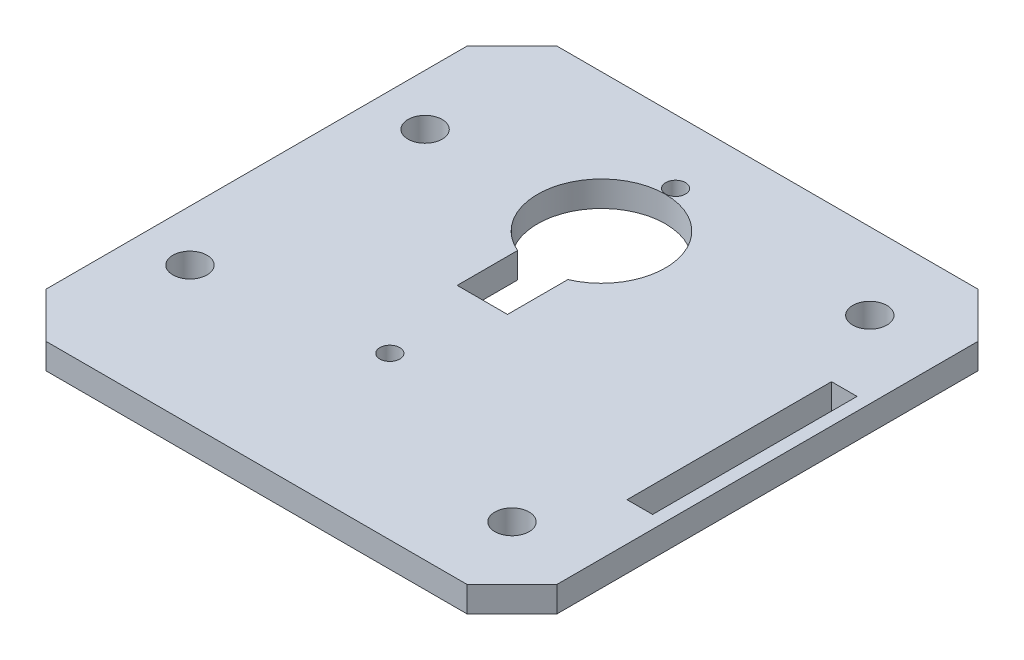
ISO-10303-21;
HEADER;
FILE_DESCRIPTION(('STEP AP214'),'2;1');
FILE_NAME('part.step','',(''),(''),'','','');
FILE_SCHEMA(('AUTOMOTIVE_DESIGN { 1 0 10303 214 1 1 1 1 }'));
ENDSEC;
DATA;
#1=APPLICATION_CONTEXT('core data for automotive mechanical design processes');
#2=APPLICATION_PROTOCOL_DEFINITION('international standard','automotive_design',2000,#1);
#3=PRODUCT_CONTEXT('',#1,'mechanical');
#4=PRODUCT('Part','Part','',(#3));
#5=PRODUCT_RELATED_PRODUCT_CATEGORY('part','',(#4));
#6=PRODUCT_DEFINITION_FORMATION('','',#4);
#7=PRODUCT_DEFINITION_CONTEXT('part definition',#1,'design');
#8=PRODUCT_DEFINITION('design','',#6,#7);
#9=PRODUCT_DEFINITION_SHAPE('','',#8);
#10=(LENGTH_UNIT() NAMED_UNIT(*) SI_UNIT(.MILLI.,.METRE.));
#11=(NAMED_UNIT(*) PLANE_ANGLE_UNIT() SI_UNIT($,.RADIAN.));
#12=(NAMED_UNIT(*) SI_UNIT($,.STERADIAN.) SOLID_ANGLE_UNIT());
#13=UNCERTAINTY_MEASURE_WITH_UNIT(LENGTH_MEASURE(1.E-05),#10,'distance_accuracy_value','');
#14=(GEOMETRIC_REPRESENTATION_CONTEXT(3) GLOBAL_UNCERTAINTY_ASSIGNED_CONTEXT((#13)) GLOBAL_UNIT_ASSIGNED_CONTEXT((#10,
#11,#12)) REPRESENTATION_CONTEXT('',''));
#15=CARTESIAN_POINT('',(0.,0.,0.));
#16=DIRECTION('',(0.,0.,1.));
#17=DIRECTION('',(1.,0.,0.));
#18=AXIS2_PLACEMENT_3D('',#15,#16,#17);
#19=CARTESIAN_POINT('',(0.,0.,0.));
#20=DIRECTION('',(0.,-1.,0.));
#21=DIRECTION('',(0.,0.,-1.));
#22=AXIS2_PLACEMENT_3D('',#19,#20,#21);
#23=PLANE('',#22);
#24=DIRECTION('',(1.,0.,0.));
#25=VECTOR('',#24,1.);
#26=CARTESIAN_POINT('',(0.,0.,-10.16));
#27=LINE('',#26,#25);
#28=CARTESIAN_POINT('',(21.59,0.,-10.16));
#29=VERTEX_POINT('',#28);
#30=CARTESIAN_POINT('',(24.13,0.,-10.16));
#31=VERTEX_POINT('',#30);
#32=EDGE_CURVE('E210',#29,#31,#27,.T.);
#33=ORIENTED_EDGE('',*,*,#32,.F.);
#34=DIRECTION('',(0.,0.,-1.));
#35=VECTOR('',#34,1.);
#36=CARTESIAN_POINT('',(21.59,0.,0.));
#37=LINE('',#36,#35);
#38=CARTESIAN_POINT('',(21.59,0.,10.16));
#39=VERTEX_POINT('',#38);
#40=EDGE_CURVE('E190',#39,#29,#37,.T.);
#41=ORIENTED_EDGE('',*,*,#40,.F.);
#42=DIRECTION('',(1.,0.,0.));
#43=VECTOR('',#42,1.);
#44=CARTESIAN_POINT('',(0.,0.,10.16));
#45=LINE('',#44,#43);
#46=CARTESIAN_POINT('',(24.13,0.,10.16));
#47=VERTEX_POINT('',#46);
#48=EDGE_CURVE('E192',#39,#47,#45,.T.);
#49=ORIENTED_EDGE('',*,*,#48,.T.);
#50=DIRECTION('',(0.,0.,-1.));
#51=VECTOR('',#50,1.);
#52=CARTESIAN_POINT('',(24.13,0.,0.));
#53=LINE('',#52,#51);
#54=EDGE_CURVE('E196',#47,#31,#53,.T.);
#55=ORIENTED_EDGE('',*,*,#54,.T.);
#56=EDGE_LOOP('',(#33,#41,#49,#55));
#57=FACE_BOUND('',#56,.T.);
#58=CARTESIAN_POINT('',(-2.79400000000002,0.,-19.05));
#59=DIRECTION('',(0.,1.,0.));
#60=DIRECTION('',(0.,0.,1.));
#61=AXIS2_PLACEMENT_3D('',#58,#59,#60);
#62=CIRCLE('',#61,0.990599999999999);
#63=CARTESIAN_POINT('',(-2.79400000000002,0.,-18.0594));
#64=VERTEX_POINT('',#63);
#65=EDGE_CURVE('E217',#64,#64,#62,.T.);
#66=ORIENTED_EDGE('',*,*,#65,.T.);
#67=EDGE_LOOP('',(#66));
#68=FACE_BOUND('',#67,.T.);
#69=CARTESIAN_POINT('',(-2.79400000000002,0.,9.3472));
#70=DIRECTION('',(0.,1.,0.));
#71=DIRECTION('',(0.,0.,1.));
#72=AXIS2_PLACEMENT_3D('',#69,#70,#71);
#73=CIRCLE('',#72,0.990600000000002);
#74=CARTESIAN_POINT('',(-2.79400000000002,0.,10.3378));
#75=VERTEX_POINT('',#74);
#76=EDGE_CURVE('E610',#75,#75,#73,.T.);
#77=ORIENTED_EDGE('',*,*,#76,.T.);
#78=EDGE_LOOP('',(#77));
#79=FACE_BOUND('',#78,.T.);
#80=CARTESIAN_POINT('',(-2.79400000000002,0.,-11.684));
#81=DIRECTION('',(0.,1.,0.));
#82=DIRECTION('',(0.,0.,1.));
#83=AXIS2_PLACEMENT_3D('',#80,#81,#82);
#84=CIRCLE('',#83,6.35);
#85=CARTESIAN_POINT('',(-0.294000000000018,0.,-5.84683459203013));
#86=VERTEX_POINT('',#85);
#87=CARTESIAN_POINT('',(-5.29400000000002,0.,-5.84683459203013));
#88=VERTEX_POINT('',#87);
#89=EDGE_CURVE('E154',#86,#88,#84,.T.);
#90=ORIENTED_EDGE('',*,*,#89,.T.);
#91=DIRECTION('',(0.,0.,1.));
#92=VECTOR('',#91,1.);
#93=CARTESIAN_POINT('',(-5.29400000000002,0.,-5.84683459203013));
#94=LINE('',#93,#92);
#95=CARTESIAN_POINT('',(-5.29400000000002,0.,0.153165407969866));
#96=VERTEX_POINT('',#95);
#97=EDGE_CURVE('E163',#88,#96,#94,.T.);
#98=ORIENTED_EDGE('',*,*,#97,.T.);
#99=DIRECTION('',(1.,0.,0.));
#100=VECTOR('',#99,1.);
#101=CARTESIAN_POINT('',(-5.29400000000002,0.,0.153165407969866));
#102=LINE('',#101,#100);
#103=CARTESIAN_POINT('',(-0.294000000000017,0.,0.153165407969866));
#104=VERTEX_POINT('',#103);
#105=EDGE_CURVE('E54',#96,#104,#102,.T.);
#106=ORIENTED_EDGE('',*,*,#105,.T.);
#107=DIRECTION('',(0.,0.,-1.));
#108=VECTOR('',#107,1.);
#109=CARTESIAN_POINT('',(-0.294000000000018,0.,-5.84683459203013));
#110=LINE('',#109,#108);
#111=EDGE_CURVE('E160',#104,#86,#110,.T.);
#112=ORIENTED_EDGE('',*,*,#111,.T.);
#113=EDGE_LOOP('',(#90,#98,#106,#112));
#114=FACE_BOUND('',#113,.T.);
#115=CARTESIAN_POINT('',(17.78,0.,17.78));
#116=DIRECTION('',(0.,1.,0.));
#117=DIRECTION('',(0.,0.,1.));
#118=AXIS2_PLACEMENT_3D('',#115,#116,#117);
#119=CIRCLE('',#118,1.7);
#120=CARTESIAN_POINT('',(17.78,0.,19.48));
#121=VERTEX_POINT('',#120);
#122=EDGE_CURVE('E266',#121,#121,#119,.T.);
#123=ORIENTED_EDGE('',*,*,#122,.T.);
#124=EDGE_LOOP('',(#123));
#125=FACE_BOUND('',#124,.T.);
#126=CARTESIAN_POINT('',(17.78,0.,-17.78));
#127=DIRECTION('',(0.,1.,0.));
#128=DIRECTION('',(0.,0.,1.));
#129=AXIS2_PLACEMENT_3D('',#126,#127,#128);
#130=CIRCLE('',#129,1.7);
#131=CARTESIAN_POINT('',(17.78,0.,-16.08));
#132=VERTEX_POINT('',#131);
#133=EDGE_CURVE('E272',#132,#132,#130,.T.);
#134=ORIENTED_EDGE('',*,*,#133,.T.);
#135=EDGE_LOOP('',(#134));
#136=FACE_BOUND('',#135,.T.);
#137=CARTESIAN_POINT('',(-20.32,0.,11.684));
#138=DIRECTION('',(0.,1.,0.));
#139=DIRECTION('',(0.,0.,1.));
#140=AXIS2_PLACEMENT_3D('',#137,#138,#139);
#141=CIRCLE('',#140,1.7);
#142=CARTESIAN_POINT('',(-20.32,0.,13.384));
#143=VERTEX_POINT('',#142);
#144=EDGE_CURVE('E278',#143,#143,#141,.T.);
#145=ORIENTED_EDGE('',*,*,#144,.T.);
#146=EDGE_LOOP('',(#145));
#147=FACE_BOUND('',#146,.T.);
#148=CARTESIAN_POINT('',(-20.32,0.,-11.684));
#149=DIRECTION('',(0.,1.,0.));
#150=DIRECTION('',(0.,0.,1.));
#151=AXIS2_PLACEMENT_3D('',#148,#149,#150);
#152=CIRCLE('',#151,1.7);
#153=CARTESIAN_POINT('',(-20.32,0.,-9.98399999999999));
#154=VERTEX_POINT('',#153);
#155=EDGE_CURVE('E284',#154,#154,#152,.T.);
#156=ORIENTED_EDGE('',*,*,#155,.T.);
#157=EDGE_LOOP('',(#156));
#158=FACE_BOUND('',#157,.T.);
#159=DIRECTION('',(0.,0.,1.));
#160=VECTOR('',#159,1.);
#161=CARTESIAN_POINT('',(-25.4,0.,25.4));
#162=LINE('',#161,#160);
#163=CARTESIAN_POINT('',(-25.4,0.,-20.9098719394654));
#164=VERTEX_POINT('',#163);
#165=CARTESIAN_POINT('',(-25.4,0.,20.9098719394654));
#166=VERTEX_POINT('',#165);
#167=EDGE_CURVE('E299',#164,#166,#162,.T.);
#168=ORIENTED_EDGE('',*,*,#167,.F.);
#169=DIRECTION('',(0.707106781186548,0.,-0.707106781186548));
#170=VECTOR('',#169,1.);
#171=CARTESIAN_POINT('',(-20.9098719394654,0.,-25.4));
#172=LINE('',#171,#170);
#173=CARTESIAN_POINT('',(-20.9098719394654,0.,-25.4));
#174=VERTEX_POINT('',#173);
#175=EDGE_CURVE('E222',#164,#174,#172,.T.);
#176=ORIENTED_EDGE('',*,*,#175,.T.);
#177=DIRECTION('',(-1.,0.,0.));
#178=VECTOR('',#177,1.);
#179=CARTESIAN_POINT('',(-25.4,0.,-25.4));
#180=LINE('',#179,#178);
#181=CARTESIAN_POINT('',(20.9098719394654,0.,-25.4));
#182=VERTEX_POINT('',#181);
#183=EDGE_CURVE('E297',#182,#174,#180,.T.);
#184=ORIENTED_EDGE('',*,*,#183,.F.);
#185=DIRECTION('',(-0.707106781186548,0.,-0.707106781186548));
#186=VECTOR('',#185,1.);
#187=CARTESIAN_POINT('',(20.9098719394654,0.,-25.4));
#188=LINE('',#187,#186);
#189=CARTESIAN_POINT('',(25.4,0.,-20.9098719394654));
#190=VERTEX_POINT('',#189);
#191=EDGE_CURVE('E232',#190,#182,#188,.T.);
#192=ORIENTED_EDGE('',*,*,#191,.F.);
#193=DIRECTION('',(0.,0.,-1.));
#194=VECTOR('',#193,1.);
#195=CARTESIAN_POINT('',(25.4,0.,25.4));
#196=LINE('',#195,#194);
#197=CARTESIAN_POINT('',(25.4,0.,20.9098719394654));
#198=VERTEX_POINT('',#197);
#199=EDGE_CURVE('E287',#198,#190,#196,.T.);
#200=ORIENTED_EDGE('',*,*,#199,.F.);
#201=DIRECTION('',(-0.707106781186548,0.,0.707106781186548));
#202=VECTOR('',#201,1.);
#203=CARTESIAN_POINT('',(20.9098719394654,0.,25.4));
#204=LINE('',#203,#202);
#205=CARTESIAN_POINT('',(20.9098719394654,0.,25.4));
#206=VERTEX_POINT('',#205);
#207=EDGE_CURVE('E243',#198,#206,#204,.T.);
#208=ORIENTED_EDGE('',*,*,#207,.T.);
#209=DIRECTION('',(1.,0.,0.));
#210=VECTOR('',#209,1.);
#211=CARTESIAN_POINT('',(-25.4,0.,25.4));
#212=LINE('',#211,#210);
#213=CARTESIAN_POINT('',(-20.9098719394654,0.,25.4));
#214=VERTEX_POINT('',#213);
#215=EDGE_CURVE('E41',#214,#206,#212,.T.);
#216=ORIENTED_EDGE('',*,*,#215,.F.);
#217=DIRECTION('',(0.707106781186548,0.,0.707106781186548));
#218=VECTOR('',#217,1.);
#219=CARTESIAN_POINT('',(-20.9098719394654,0.,25.4));
#220=LINE('',#219,#218);
#221=EDGE_CURVE('E253',#166,#214,#220,.T.);
#222=ORIENTED_EDGE('',*,*,#221,.F.);
#223=EDGE_LOOP('',(#168,#176,#184,#192,#200,#208,#216,#222));
#224=FACE_BOUND('',#223,.T.);
#225=ADVANCED_FACE('F37',(#57,#68,#79,#114,#125,#136,#147,#158,#224),#23,.T.);
#226=CARTESIAN_POINT('',(0.,2.54,0.));
#227=DIRECTION('',(0.,-1.,0.));
#228=DIRECTION('',(0.,0.,-1.));
#229=AXIS2_PLACEMENT_3D('',#226,#227,#228);
#230=PLANE('',#229);
#231=CARTESIAN_POINT('',(-2.79400000000002,2.54,-19.05));
#232=DIRECTION('',(0.,1.,0.));
#233=DIRECTION('',(0.,0.,1.));
#234=AXIS2_PLACEMENT_3D('',#231,#232,#233);
#235=CIRCLE('',#234,0.990599999999999);
#236=CARTESIAN_POINT('',(-2.79400000000002,2.54,-18.0594));
#237=VERTEX_POINT('',#236);
#238=EDGE_CURVE('E609',#237,#237,#235,.T.);
#239=ORIENTED_EDGE('',*,*,#238,.F.);
#240=EDGE_LOOP('',(#239));
#241=FACE_BOUND('',#240,.T.);
#242=CARTESIAN_POINT('',(-2.79400000000002,2.54,9.3472));
#243=DIRECTION('',(0.,1.,0.));
#244=DIRECTION('',(0.,0.,1.));
#245=AXIS2_PLACEMENT_3D('',#242,#243,#244);
#246=CIRCLE('',#245,0.990600000000002);
#247=CARTESIAN_POINT('',(-2.79400000000002,2.54,10.3378));
#248=VERTEX_POINT('',#247);
#249=EDGE_CURVE('E175',#248,#248,#246,.T.);
#250=ORIENTED_EDGE('',*,*,#249,.F.);
#251=EDGE_LOOP('',(#250));
#252=FACE_BOUND('',#251,.T.);
#253=DIRECTION('',(0.,0.,1.));
#254=VECTOR('',#253,1.);
#255=CARTESIAN_POINT('',(-5.29400000000002,2.54,-5.84683459203013));
#256=LINE('',#255,#254);
#257=CARTESIAN_POINT('',(-5.29400000000002,2.54,-5.84683459203013));
#258=VERTEX_POINT('',#257);
#259=CARTESIAN_POINT('',(-5.29400000000002,2.54,0.153165407969866));
#260=VERTEX_POINT('',#259);
#261=EDGE_CURVE('E181',#258,#260,#256,.T.);
#262=ORIENTED_EDGE('',*,*,#261,.F.);
#263=CARTESIAN_POINT('',(-2.79400000000002,2.54,-11.684));
#264=DIRECTION('',(0.,1.,0.));
#265=DIRECTION('',(0.,0.,1.));
#266=AXIS2_PLACEMENT_3D('',#263,#264,#265);
#267=CIRCLE('',#266,6.35);
#268=CARTESIAN_POINT('',(-0.294000000000018,2.54,-5.84683459203013));
#269=VERTEX_POINT('',#268);
#270=EDGE_CURVE('E62',#269,#258,#267,.T.);
#271=ORIENTED_EDGE('',*,*,#270,.F.);
#272=DIRECTION('',(0.,0.,-1.));
#273=VECTOR('',#272,1.);
#274=CARTESIAN_POINT('',(-0.294000000000018,2.54,-5.84683459203013));
#275=LINE('',#274,#273);
#276=CARTESIAN_POINT('',(-0.294000000000017,2.54,0.153165407969866));
#277=VERTEX_POINT('',#276);
#278=EDGE_CURVE('E169',#277,#269,#275,.T.);
#279=ORIENTED_EDGE('',*,*,#278,.F.);
#280=DIRECTION('',(1.,0.,0.));
#281=VECTOR('',#280,1.);
#282=CARTESIAN_POINT('',(-5.29400000000002,2.54,0.153165407969866));
#283=LINE('',#282,#281);
#284=EDGE_CURVE('E172',#260,#277,#283,.T.);
#285=ORIENTED_EDGE('',*,*,#284,.F.);
#286=EDGE_LOOP('',(#262,#271,#279,#285));
#287=FACE_BOUND('',#286,.T.);
#288=DIRECTION('',(0.,0.,-1.));
#289=VECTOR('',#288,1.);
#290=CARTESIAN_POINT('',(21.59,2.54,0.));
#291=LINE('',#290,#289);
#292=CARTESIAN_POINT('',(21.59,2.54,10.16));
#293=VERTEX_POINT('',#292);
#294=CARTESIAN_POINT('',(21.59,2.54,-10.16));
#295=VERTEX_POINT('',#294);
#296=EDGE_CURVE('E199',#293,#295,#291,.T.);
#297=ORIENTED_EDGE('',*,*,#296,.T.);
#298=DIRECTION('',(1.,0.,0.));
#299=VECTOR('',#298,1.);
#300=CARTESIAN_POINT('',(0.,2.54,-10.16));
#301=LINE('',#300,#299);
#302=CARTESIAN_POINT('',(24.13,2.54,-10.16));
#303=VERTEX_POINT('',#302);
#304=EDGE_CURVE('E214',#295,#303,#301,.T.);
#305=ORIENTED_EDGE('',*,*,#304,.T.);
#306=DIRECTION('',(0.,0.,-1.));
#307=VECTOR('',#306,1.);
#308=CARTESIAN_POINT('',(24.13,2.54,0.));
#309=LINE('',#308,#307);
#310=CARTESIAN_POINT('',(24.13,2.54,10.16));
#311=VERTEX_POINT('',#310);
#312=EDGE_CURVE('E193',#311,#303,#309,.T.);
#313=ORIENTED_EDGE('',*,*,#312,.F.);
#314=DIRECTION('',(1.,0.,0.));
#315=VECTOR('',#314,1.);
#316=CARTESIAN_POINT('',(0.,2.54,10.16));
#317=LINE('',#316,#315);
#318=EDGE_CURVE('E201',#293,#311,#317,.T.);
#319=ORIENTED_EDGE('',*,*,#318,.F.);
#320=EDGE_LOOP('',(#297,#305,#313,#319));
#321=FACE_BOUND('',#320,.T.);
#322=CARTESIAN_POINT('',(17.78,2.54,17.78));
#323=DIRECTION('',(0.,1.,0.));
#324=DIRECTION('',(0.,0.,1.));
#325=AXIS2_PLACEMENT_3D('',#322,#323,#324);
#326=CIRCLE('',#325,1.69999999999999);
#327=CARTESIAN_POINT('',(17.78,2.54,19.48));
#328=VERTEX_POINT('',#327);
#329=EDGE_CURVE('E263',#328,#328,#326,.T.);
#330=ORIENTED_EDGE('',*,*,#329,.F.);
#331=EDGE_LOOP('',(#330));
#332=FACE_BOUND('',#331,.T.);
#333=CARTESIAN_POINT('',(17.78,2.54,-17.78));
#334=DIRECTION('',(0.,1.,0.));
#335=DIRECTION('',(0.,0.,1.));
#336=AXIS2_PLACEMENT_3D('',#333,#334,#335);
#337=CIRCLE('',#336,1.69999999999999);
#338=CARTESIAN_POINT('',(17.78,2.54,-16.08));
#339=VERTEX_POINT('',#338);
#340=EDGE_CURVE('E269',#339,#339,#337,.T.);
#341=ORIENTED_EDGE('',*,*,#340,.F.);
#342=EDGE_LOOP('',(#341));
#343=FACE_BOUND('',#342,.T.);
#344=CARTESIAN_POINT('',(-20.32,2.54,11.684));
#345=DIRECTION('',(0.,1.,0.));
#346=DIRECTION('',(0.,0.,1.));
#347=AXIS2_PLACEMENT_3D('',#344,#345,#346);
#348=CIRCLE('',#347,1.69999999999999);
#349=CARTESIAN_POINT('',(-20.32,2.54,13.384));
#350=VERTEX_POINT('',#349);
#351=EDGE_CURVE('E275',#350,#350,#348,.T.);
#352=ORIENTED_EDGE('',*,*,#351,.F.);
#353=EDGE_LOOP('',(#352));
#354=FACE_BOUND('',#353,.T.);
#355=CARTESIAN_POINT('',(-20.32,2.54,-11.684));
#356=DIRECTION('',(0.,1.,0.));
#357=DIRECTION('',(0.,0.,1.));
#358=AXIS2_PLACEMENT_3D('',#355,#356,#357);
#359=CIRCLE('',#358,1.69999999999999);
#360=CARTESIAN_POINT('',(-20.32,2.54,-9.98400000000001));
#361=VERTEX_POINT('',#360);
#362=EDGE_CURVE('E281',#361,#361,#359,.T.);
#363=ORIENTED_EDGE('',*,*,#362,.F.);
#364=EDGE_LOOP('',(#363));
#365=FACE_BOUND('',#364,.T.);
#366=DIRECTION('',(-1.,0.,0.));
#367=VECTOR('',#366,1.);
#368=CARTESIAN_POINT('',(-25.4,2.54,-25.4));
#369=LINE('',#368,#367);
#370=CARTESIAN_POINT('',(20.9098719394654,2.54000000000003,-25.4));
#371=VERTEX_POINT('',#370);
#372=CARTESIAN_POINT('',(-20.9098719394654,2.54,-25.4));
#373=VERTEX_POINT('',#372);
#374=EDGE_CURVE('E291',#371,#373,#369,.T.);
#375=ORIENTED_EDGE('',*,*,#374,.T.);
#376=DIRECTION('',(0.707106781186548,0.,-0.707106781186548));
#377=VECTOR('',#376,1.);
#378=CARTESIAN_POINT('',(-20.9098719394654,2.54,-25.4));
#379=LINE('',#378,#377);
#380=CARTESIAN_POINT('',(-25.4,2.54,-20.9098719394654));
#381=VERTEX_POINT('',#380);
#382=EDGE_CURVE('E208',#381,#373,#379,.T.);
#383=ORIENTED_EDGE('',*,*,#382,.F.);
#384=DIRECTION('',(0.,0.,1.));
#385=VECTOR('',#384,1.);
#386=CARTESIAN_POINT('',(-25.4,2.54,25.4));
#387=LINE('',#386,#385);
#388=CARTESIAN_POINT('',(-25.4,2.54,20.9098719394654));
#389=VERTEX_POINT('',#388);
#390=EDGE_CURVE('E46',#381,#389,#387,.T.);
#391=ORIENTED_EDGE('',*,*,#390,.T.);
#392=DIRECTION('',(0.707106781186548,0.,0.707106781186548));
#393=VECTOR('',#392,1.);
#394=CARTESIAN_POINT('',(-20.9098719394654,2.54,25.4));
#395=LINE('',#394,#393);
#396=CARTESIAN_POINT('',(-20.9098719394654,2.54,25.4));
#397=VERTEX_POINT('',#396);
#398=EDGE_CURVE('E252',#389,#397,#395,.T.);
#399=ORIENTED_EDGE('',*,*,#398,.T.);
#400=DIRECTION('',(1.,0.,0.));
#401=VECTOR('',#400,1.);
#402=CARTESIAN_POINT('',(-25.4,2.54,25.4));
#403=LINE('',#402,#401);
#404=CARTESIAN_POINT('',(20.9098719394654,2.54000000000003,25.4));
#405=VERTEX_POINT('',#404);
#406=EDGE_CURVE('E11',#397,#405,#403,.T.);
#407=ORIENTED_EDGE('',*,*,#406,.T.);
#408=DIRECTION('',(-0.707106781186548,0.,0.707106781186548));
#409=VECTOR('',#408,1.);
#410=CARTESIAN_POINT('',(20.9098719394654,2.54,25.4));
#411=LINE('',#410,#409);
#412=CARTESIAN_POINT('',(25.4,2.54000000000003,20.9098719394654));
#413=VERTEX_POINT('',#412);
#414=EDGE_CURVE('E242',#413,#405,#411,.T.);
#415=ORIENTED_EDGE('',*,*,#414,.F.);
#416=DIRECTION('',(0.,0.,-1.));
#417=VECTOR('',#416,1.);
#418=CARTESIAN_POINT('',(25.4,2.54,25.4));
#419=LINE('',#418,#417);
#420=CARTESIAN_POINT('',(25.4,2.54,-20.9098719394654));
#421=VERTEX_POINT('',#420);
#422=EDGE_CURVE('E288',#413,#421,#419,.T.);
#423=ORIENTED_EDGE('',*,*,#422,.T.);
#424=DIRECTION('',(-0.707106781186548,0.,-0.707106781186548));
#425=VECTOR('',#424,1.);
#426=CARTESIAN_POINT('',(20.9098719394654,2.54,-25.4));
#427=LINE('',#426,#425);
#428=EDGE_CURVE('E231',#421,#371,#427,.T.);
#429=ORIENTED_EDGE('',*,*,#428,.T.);
#430=EDGE_LOOP('',(#375,#383,#391,#399,#407,#415,#423,#429));
#431=FACE_BOUND('',#430,.T.);
#432=ADVANCED_FACE('F319',(#241,#252,#287,#321,#332,#343,#354,#365,#431),#230,.F.);
#433=CARTESIAN_POINT('',(25.4,2.54,25.4));
#434=DIRECTION('',(-1.,0.,0.));
#435=DIRECTION('',(0.,0.,1.));
#436=AXIS2_PLACEMENT_3D('',#433,#434,#435);
#437=PLANE('',#436);
#438=DIRECTION('',(0.,-1.,0.));
#439=VECTOR('',#438,1.);
#440=CARTESIAN_POINT('',(25.4,95.5736702828392,-20.9098719394654));
#441=LINE('',#440,#439);
#442=EDGE_CURVE('E235',#421,#190,#441,.T.);
#443=ORIENTED_EDGE('',*,*,#442,.F.);
#444=ORIENTED_EDGE('',*,*,#422,.F.);
#445=DIRECTION('',(0.,-1.,0.));
#446=VECTOR('',#445,1.);
#447=CARTESIAN_POINT('',(25.4,92.3986702828391,20.9098719394654));
#448=LINE('',#447,#446);
#449=EDGE_CURVE('E246',#413,#198,#448,.T.);
#450=ORIENTED_EDGE('',*,*,#449,.T.);
#451=ORIENTED_EDGE('',*,*,#199,.T.);
#452=EDGE_LOOP('',(#443,#444,#450,#451));
#453=FACE_BOUND('',#452,.T.);
#454=ADVANCED_FACE('F39',(#453),#437,.F.);
#455=CARTESIAN_POINT('',(-25.4,2.54,-25.4));
#456=DIRECTION('',(0.,0.,1.));
#457=DIRECTION('',(1.,0.,0.));
#458=AXIS2_PLACEMENT_3D('',#455,#456,#457);
#459=PLANE('',#458);
#460=ORIENTED_EDGE('',*,*,#183,.T.);
#461=DIRECTION('',(0.,-1.,0.));
#462=VECTOR('',#461,1.);
#463=CARTESIAN_POINT('',(-20.9098719394654,92.3986702828392,-25.4));
#464=LINE('',#463,#462);
#465=EDGE_CURVE('E229',#373,#174,#464,.T.);
#466=ORIENTED_EDGE('',*,*,#465,.F.);
#467=ORIENTED_EDGE('',*,*,#374,.F.);
#468=DIRECTION('',(0.,-1.,0.));
#469=VECTOR('',#468,1.);
#470=CARTESIAN_POINT('',(20.9098719394654,95.5736702828392,-25.4));
#471=LINE('',#470,#469);
#472=EDGE_CURVE('E240',#371,#182,#471,.T.);
#473=ORIENTED_EDGE('',*,*,#472,.T.);
#474=EDGE_LOOP('',(#460,#466,#467,#473));
#475=FACE_BOUND('',#474,.T.);
#476=ADVANCED_FACE('F325',(#475),#459,.F.);
#477=CARTESIAN_POINT('',(-25.4,2.54,25.4));
#478=DIRECTION('',(1.,0.,0.));
#479=DIRECTION('',(0.,0.,-1.));
#480=AXIS2_PLACEMENT_3D('',#477,#478,#479);
#481=PLANE('',#480);
#482=ORIENTED_EDGE('',*,*,#390,.F.);
#483=DIRECTION('',(0.,-1.,0.));
#484=VECTOR('',#483,1.);
#485=CARTESIAN_POINT('',(-25.4,92.3986702828392,-20.9098719394654));
#486=LINE('',#485,#484);
#487=EDGE_CURVE('E225',#381,#164,#486,.T.);
#488=ORIENTED_EDGE('',*,*,#487,.T.);
#489=ORIENTED_EDGE('',*,*,#167,.T.);
#490=DIRECTION('',(0.,-1.,0.));
#491=VECTOR('',#490,1.);
#492=CARTESIAN_POINT('',(-25.4,95.5736702828391,20.9098719394654));
#493=LINE('',#492,#491);
#494=EDGE_CURVE('E256',#389,#166,#493,.T.);
#495=ORIENTED_EDGE('',*,*,#494,.F.);
#496=EDGE_LOOP('',(#482,#488,#489,#495));
#497=FACE_BOUND('',#496,.T.);
#498=ADVANCED_FACE('F331',(#497),#481,.F.);
#499=CARTESIAN_POINT('',(-25.4,2.54,25.4));
#500=DIRECTION('',(0.,0.,-1.));
#501=DIRECTION('',(-1.,0.,0.));
#502=AXIS2_PLACEMENT_3D('',#499,#500,#501);
#503=PLANE('',#502);
#504=ORIENTED_EDGE('',*,*,#215,.T.);
#505=DIRECTION('',(0.,-1.,0.));
#506=VECTOR('',#505,1.);
#507=CARTESIAN_POINT('',(20.9098719394654,92.3986702828391,25.4));
#508=LINE('',#507,#506);
#509=EDGE_CURVE('E250',#405,#206,#508,.T.);
#510=ORIENTED_EDGE('',*,*,#509,.F.);
#511=ORIENTED_EDGE('',*,*,#406,.F.);
#512=DIRECTION('',(0.,-1.,0.));
#513=VECTOR('',#512,1.);
#514=CARTESIAN_POINT('',(-20.9098719394654,95.5736702828391,25.4));
#515=LINE('',#514,#513);
#516=EDGE_CURVE('E260',#397,#214,#515,.T.);
#517=ORIENTED_EDGE('',*,*,#516,.T.);
#518=EDGE_LOOP('',(#504,#510,#511,#517));
#519=FACE_BOUND('',#518,.T.);
#520=ADVANCED_FACE('F307',(#519),#503,.F.);
#521=CARTESIAN_POINT('',(-20.32,2.54,-11.684));
#522=DIRECTION('',(0.,1.,0.));
#523=DIRECTION('',(0.,0.,1.));
#524=AXIS2_PLACEMENT_3D('',#521,#522,#523);
#525=CYLINDRICAL_SURFACE('',#524,1.69999999999999);
#526=ORIENTED_EDGE('',*,*,#155,.F.);
#527=EDGE_LOOP('',(#526));
#528=FACE_BOUND('',#527,.T.);
#529=ORIENTED_EDGE('',*,*,#362,.T.);
#530=EDGE_LOOP('',(#529));
#531=FACE_BOUND('',#530,.T.);
#532=ADVANCED_FACE('F360',(#528,#531),#525,.F.);
#533=CARTESIAN_POINT('',(-20.32,2.54,11.684));
#534=DIRECTION('',(0.,1.,0.));
#535=DIRECTION('',(0.,0.,1.));
#536=AXIS2_PLACEMENT_3D('',#533,#534,#535);
#537=CYLINDRICAL_SURFACE('',#536,1.69999999999999);
#538=ORIENTED_EDGE('',*,*,#144,.F.);
#539=EDGE_LOOP('',(#538));
#540=FACE_BOUND('',#539,.T.);
#541=ORIENTED_EDGE('',*,*,#351,.T.);
#542=EDGE_LOOP('',(#541));
#543=FACE_BOUND('',#542,.T.);
#544=ADVANCED_FACE('F540',(#540,#543),#537,.F.);
#545=CARTESIAN_POINT('',(17.78,2.54,-17.78));
#546=DIRECTION('',(0.,1.,0.));
#547=DIRECTION('',(0.,0.,1.));
#548=AXIS2_PLACEMENT_3D('',#545,#546,#547);
#549=CYLINDRICAL_SURFACE('',#548,1.69999999999999);
#550=ORIENTED_EDGE('',*,*,#133,.F.);
#551=EDGE_LOOP('',(#550));
#552=FACE_BOUND('',#551,.T.);
#553=ORIENTED_EDGE('',*,*,#340,.T.);
#554=EDGE_LOOP('',(#553));
#555=FACE_BOUND('',#554,.T.);
#556=ADVANCED_FACE('F343',(#552,#555),#549,.F.);
#557=CARTESIAN_POINT('',(17.78,2.54,17.78));
#558=DIRECTION('',(0.,1.,0.));
#559=DIRECTION('',(0.,0.,1.));
#560=AXIS2_PLACEMENT_3D('',#557,#558,#559);
#561=CYLINDRICAL_SURFACE('',#560,1.69999999999999);
#562=ORIENTED_EDGE('',*,*,#122,.F.);
#563=EDGE_LOOP('',(#562));
#564=FACE_BOUND('',#563,.T.);
#565=ORIENTED_EDGE('',*,*,#329,.T.);
#566=EDGE_LOOP('',(#565));
#567=FACE_BOUND('',#566,.T.);
#568=ADVANCED_FACE('F336',(#564,#567),#561,.F.);
#569=CARTESIAN_POINT('',(-20.9098719394654,95.5736702828391,25.4));
#570=DIRECTION('',(-0.707106781186547,0.,0.707106781186547));
#571=DIRECTION('',(0.707106781186548,0.,0.707106781186548));
#572=AXIS2_PLACEMENT_3D('',#569,#570,#571);
#573=PLANE('',#572);
#574=ORIENTED_EDGE('',*,*,#398,.F.);
#575=ORIENTED_EDGE('',*,*,#494,.T.);
#576=ORIENTED_EDGE('',*,*,#221,.T.);
#577=ORIENTED_EDGE('',*,*,#516,.F.);
#578=EDGE_LOOP('',(#574,#575,#576,#577));
#579=FACE_BOUND('',#578,.T.);
#580=ADVANCED_FACE('F334',(#579),#573,.T.);
#581=CARTESIAN_POINT('',(20.9098719394654,92.3986702828391,25.4));
#582=DIRECTION('',(-0.707106781186548,0.,-0.707106781186548));
#583=DIRECTION('',(-0.707106781186548,0.,0.707106781186548));
#584=AXIS2_PLACEMENT_3D('',#581,#582,#583);
#585=PLANE('',#584);
#586=ORIENTED_EDGE('',*,*,#414,.T.);
#587=ORIENTED_EDGE('',*,*,#509,.T.);
#588=ORIENTED_EDGE('',*,*,#207,.F.);
#589=ORIENTED_EDGE('',*,*,#449,.F.);
#590=EDGE_LOOP('',(#586,#587,#588,#589));
#591=FACE_BOUND('',#590,.T.);
#592=ADVANCED_FACE('F313',(#591),#585,.F.);
#593=CARTESIAN_POINT('',(20.9098719394654,95.5736702828392,-25.4));
#594=DIRECTION('',(0.707106781186547,0.,-0.707106781186547));
#595=DIRECTION('',(-0.707106781186548,0.,-0.707106781186548));
#596=AXIS2_PLACEMENT_3D('',#593,#594,#595);
#597=PLANE('',#596);
#598=ORIENTED_EDGE('',*,*,#428,.F.);
#599=ORIENTED_EDGE('',*,*,#442,.T.);
#600=ORIENTED_EDGE('',*,*,#191,.T.);
#601=ORIENTED_EDGE('',*,*,#472,.F.);
#602=EDGE_LOOP('',(#598,#599,#600,#601));
#603=FACE_BOUND('',#602,.T.);
#604=ADVANCED_FACE('F322',(#603),#597,.T.);
#605=CARTESIAN_POINT('',(-20.9098719394654,92.3986702828392,-25.4));
#606=DIRECTION('',(0.707106781186548,0.,0.707106781186548));
#607=DIRECTION('',(0.707106781186548,0.,-0.707106781186548));
#608=AXIS2_PLACEMENT_3D('',#605,#606,#607);
#609=PLANE('',#608);
#610=ORIENTED_EDGE('',*,*,#382,.T.);
#611=ORIENTED_EDGE('',*,*,#465,.T.);
#612=ORIENTED_EDGE('',*,*,#175,.F.);
#613=ORIENTED_EDGE('',*,*,#487,.F.);
#614=EDGE_LOOP('',(#610,#611,#612,#613));
#615=FACE_BOUND('',#614,.T.);
#616=ADVANCED_FACE('F328',(#615),#609,.F.);
#617=CARTESIAN_POINT('',(0.,0.,-10.16));
#618=DIRECTION('',(0.,0.,1.));
#619=DIRECTION('',(1.,0.,0.));
#620=AXIS2_PLACEMENT_3D('',#617,#618,#619);
#621=PLANE('',#620);
#622=ORIENTED_EDGE('',*,*,#304,.F.);
#623=DIRECTION('',(0.,1.,0.));
#624=VECTOR('',#623,1.);
#625=CARTESIAN_POINT('',(21.59,0.,-10.16));
#626=LINE('',#625,#624);
#627=EDGE_CURVE('E213',#29,#295,#626,.T.);
#628=ORIENTED_EDGE('',*,*,#627,.F.);
#629=ORIENTED_EDGE('',*,*,#32,.T.);
#630=DIRECTION('',(0.,1.,0.));
#631=VECTOR('',#630,1.);
#632=CARTESIAN_POINT('',(24.13,0.,-10.16));
#633=LINE('',#632,#631);
#634=EDGE_CURVE('E202',#31,#303,#633,.T.);
#635=ORIENTED_EDGE('',*,*,#634,.T.);
#636=EDGE_LOOP('',(#622,#628,#629,#635));
#637=FACE_BOUND('',#636,.T.);
#638=ADVANCED_FACE('F388',(#637),#621,.T.);
#639=CARTESIAN_POINT('',(24.13,0.,0.));
#640=DIRECTION('',(1.,0.,0.));
#641=DIRECTION('',(0.,0.,-1.));
#642=AXIS2_PLACEMENT_3D('',#639,#640,#641);
#643=PLANE('',#642);
#644=ORIENTED_EDGE('',*,*,#312,.T.);
#645=ORIENTED_EDGE('',*,*,#634,.F.);
#646=ORIENTED_EDGE('',*,*,#54,.F.);
#647=DIRECTION('',(0.,1.,0.));
#648=VECTOR('',#647,1.);
#649=CARTESIAN_POINT('',(24.13,0.,10.16));
#650=LINE('',#649,#648);
#651=EDGE_CURVE('E206',#47,#311,#650,.T.);
#652=ORIENTED_EDGE('',*,*,#651,.T.);
#653=EDGE_LOOP('',(#644,#645,#646,#652));
#654=FACE_BOUND('',#653,.T.);
#655=ADVANCED_FACE('F382',(#654),#643,.F.);
#656=CARTESIAN_POINT('',(0.,0.,10.16));
#657=DIRECTION('',(0.,0.,1.));
#658=DIRECTION('',(1.,0.,0.));
#659=AXIS2_PLACEMENT_3D('',#656,#657,#658);
#660=PLANE('',#659);
#661=ORIENTED_EDGE('',*,*,#318,.T.);
#662=ORIENTED_EDGE('',*,*,#651,.F.);
#663=ORIENTED_EDGE('',*,*,#48,.F.);
#664=DIRECTION('',(0.,1.,0.));
#665=VECTOR('',#664,1.);
#666=CARTESIAN_POINT('',(21.59,0.,10.16));
#667=LINE('',#666,#665);
#668=EDGE_CURVE('E198',#39,#293,#667,.T.);
#669=ORIENTED_EDGE('',*,*,#668,.T.);
#670=EDGE_LOOP('',(#661,#662,#663,#669));
#671=FACE_BOUND('',#670,.T.);
#672=ADVANCED_FACE('F387',(#671),#660,.F.);
#673=CARTESIAN_POINT('',(21.59,0.,0.));
#674=DIRECTION('',(1.,0.,0.));
#675=DIRECTION('',(0.,0.,-1.));
#676=AXIS2_PLACEMENT_3D('',#673,#674,#675);
#677=PLANE('',#676);
#678=ORIENTED_EDGE('',*,*,#296,.F.);
#679=ORIENTED_EDGE('',*,*,#668,.F.);
#680=ORIENTED_EDGE('',*,*,#40,.T.);
#681=ORIENTED_EDGE('',*,*,#627,.T.);
#682=EDGE_LOOP('',(#678,#679,#680,#681));
#683=FACE_BOUND('',#682,.T.);
#684=ADVANCED_FACE('F398',(#683),#677,.T.);
#685=CARTESIAN_POINT('',(-2.79400000000002,0.,-11.684));
#686=DIRECTION('',(0.,1.,0.));
#687=DIRECTION('',(0.,0.,1.));
#688=AXIS2_PLACEMENT_3D('',#685,#686,#687);
#689=CYLINDRICAL_SURFACE('',#688,6.35);
#690=ORIENTED_EDGE('',*,*,#270,.T.);
#691=DIRECTION('',(0.,1.,0.));
#692=VECTOR('',#691,1.);
#693=CARTESIAN_POINT('',(-5.29400000000002,0.,-5.84683459203013));
#694=LINE('',#693,#692);
#695=EDGE_CURVE('E150',#88,#258,#694,.T.);
#696=ORIENTED_EDGE('',*,*,#695,.F.);
#697=ORIENTED_EDGE('',*,*,#89,.F.);
#698=DIRECTION('',(0.,1.,0.));
#699=VECTOR('',#698,1.);
#700=CARTESIAN_POINT('',(-0.294000000000018,0.,-5.84683459203013));
#701=LINE('',#700,#699);
#702=EDGE_CURVE('E185',#86,#269,#701,.T.);
#703=ORIENTED_EDGE('',*,*,#702,.T.);
#704=EDGE_LOOP('',(#690,#696,#697,#703));
#705=FACE_BOUND('',#704,.T.);
#706=ADVANCED_FACE('F152',(#705),#689,.F.);
#707=CARTESIAN_POINT('',(-0.294000000000018,0.,-5.84683459203013));
#708=DIRECTION('',(1.,0.,0.));
#709=DIRECTION('',(0.,0.,-1.));
#710=AXIS2_PLACEMENT_3D('',#707,#708,#709);
#711=PLANE('',#710);
#712=ORIENTED_EDGE('',*,*,#278,.T.);
#713=ORIENTED_EDGE('',*,*,#702,.F.);
#714=ORIENTED_EDGE('',*,*,#111,.F.);
#715=DIRECTION('',(0.,1.,0.));
#716=VECTOR('',#715,1.);
#717=CARTESIAN_POINT('',(-0.294000000000017,0.,0.153165407969866));
#718=LINE('',#717,#716);
#719=EDGE_CURVE('E187',#104,#277,#718,.T.);
#720=ORIENTED_EDGE('',*,*,#719,.T.);
#721=EDGE_LOOP('',(#712,#713,#714,#720));
#722=FACE_BOUND('',#721,.T.);
#723=ADVANCED_FACE('F413',(#722),#711,.F.);
#724=CARTESIAN_POINT('',(-5.29400000000002,0.,0.153165407969866));
#725=DIRECTION('',(0.,0.,1.));
#726=DIRECTION('',(1.,0.,0.));
#727=AXIS2_PLACEMENT_3D('',#724,#725,#726);
#728=PLANE('',#727);
#729=ORIENTED_EDGE('',*,*,#284,.T.);
#730=ORIENTED_EDGE('',*,*,#719,.F.);
#731=ORIENTED_EDGE('',*,*,#105,.F.);
#732=DIRECTION('',(0.,1.,0.));
#733=VECTOR('',#732,1.);
#734=CARTESIAN_POINT('',(-5.29400000000002,0.,0.153165407969866));
#735=LINE('',#734,#733);
#736=EDGE_CURVE('E159',#96,#260,#735,.T.);
#737=ORIENTED_EDGE('',*,*,#736,.T.);
#738=EDGE_LOOP('',(#729,#730,#731,#737));
#739=FACE_BOUND('',#738,.T.);
#740=ADVANCED_FACE('F420',(#739),#728,.F.);
#741=CARTESIAN_POINT('',(-5.29400000000002,0.,-5.84683459203013));
#742=DIRECTION('',(-1.,0.,0.));
#743=DIRECTION('',(0.,0.,1.));
#744=AXIS2_PLACEMENT_3D('',#741,#742,#743);
#745=PLANE('',#744);
#746=ORIENTED_EDGE('',*,*,#261,.T.);
#747=ORIENTED_EDGE('',*,*,#736,.F.);
#748=ORIENTED_EDGE('',*,*,#97,.F.);
#749=ORIENTED_EDGE('',*,*,#695,.T.);
#750=EDGE_LOOP('',(#746,#747,#748,#749));
#751=FACE_BOUND('',#750,.T.);
#752=ADVANCED_FACE('F164',(#751),#745,.F.);
#753=CARTESIAN_POINT('',(-2.79400000000002,0.,9.3472));
#754=DIRECTION('',(0.,1.,0.));
#755=DIRECTION('',(0.,0.,1.));
#756=AXIS2_PLACEMENT_3D('',#753,#754,#755);
#757=CYLINDRICAL_SURFACE('',#756,0.990600000000002);
#758=ORIENTED_EDGE('',*,*,#76,.F.);
#759=EDGE_LOOP('',(#758));
#760=FACE_BOUND('',#759,.T.);
#761=ORIENTED_EDGE('',*,*,#249,.T.);
#762=EDGE_LOOP('',(#761));
#763=FACE_BOUND('',#762,.T.);
#764=ADVANCED_FACE('F434',(#760,#763),#757,.F.);
#765=CARTESIAN_POINT('',(-2.79400000000002,0.,-19.05));
#766=DIRECTION('',(0.,1.,0.));
#767=DIRECTION('',(0.,0.,1.));
#768=AXIS2_PLACEMENT_3D('',#765,#766,#767);
#769=CYLINDRICAL_SURFACE('',#768,0.990599999999999);
#770=ORIENTED_EDGE('',*,*,#65,.F.);
#771=EDGE_LOOP('',(#770));
#772=FACE_BOUND('',#771,.T.);
#773=ORIENTED_EDGE('',*,*,#238,.T.);
#774=EDGE_LOOP('',(#773));
#775=FACE_BOUND('',#774,.T.);
#776=ADVANCED_FACE('F441',(#772,#775),#769,.F.);
#777=CLOSED_SHELL('',(#225,#432,#454,#476,#498,#520,#532,#544,#556,#568,#580,#592,#604,#616,
#638,#655,#672,#684,#706,#723,#740,#752,#764,#776));
#778=MANIFOLD_SOLID_BREP('B2',#777);
#779=ADVANCED_BREP_SHAPE_REPRESENTATION('',(#18,#778),#14);
#780=SHAPE_DEFINITION_REPRESENTATION(#9,#779);
ENDSEC;
END-ISO-10303-21;
